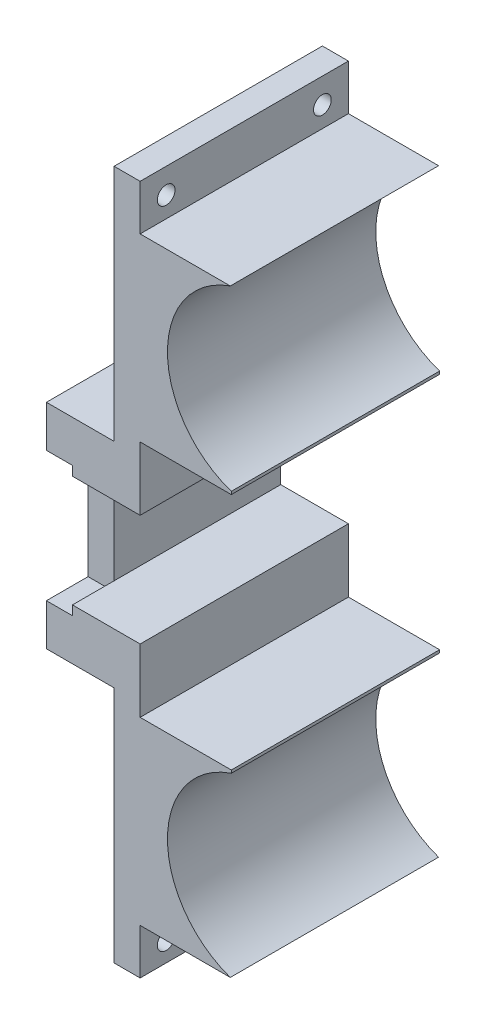
ISO-10303-21;
HEADER;
FILE_DESCRIPTION(('STEP AP214'),'2;1');
FILE_NAME('part.step','',(''),(''),'','','');
FILE_SCHEMA(('AUTOMOTIVE_DESIGN { 1 0 10303 214 1 1 1 1 }'));
ENDSEC;
DATA;
#1=APPLICATION_CONTEXT('core data for automotive mechanical design processes');
#2=APPLICATION_PROTOCOL_DEFINITION('international standard','automotive_design',2000,#1);
#3=PRODUCT_CONTEXT('',#1,'mechanical');
#4=PRODUCT('Part','Part','',(#3));
#5=PRODUCT_RELATED_PRODUCT_CATEGORY('part','',(#4));
#6=PRODUCT_DEFINITION_FORMATION('','',#4);
#7=PRODUCT_DEFINITION_CONTEXT('part definition',#1,'design');
#8=PRODUCT_DEFINITION('design','',#6,#7);
#9=PRODUCT_DEFINITION_SHAPE('','',#8);
#10=(LENGTH_UNIT() NAMED_UNIT(*) SI_UNIT(.MILLI.,.METRE.));
#11=(NAMED_UNIT(*) PLANE_ANGLE_UNIT() SI_UNIT($,.RADIAN.));
#12=(NAMED_UNIT(*) SI_UNIT($,.STERADIAN.) SOLID_ANGLE_UNIT());
#13=UNCERTAINTY_MEASURE_WITH_UNIT(LENGTH_MEASURE(1.E-05),#10,'distance_accuracy_value','');
#14=(GEOMETRIC_REPRESENTATION_CONTEXT(3) GLOBAL_UNCERTAINTY_ASSIGNED_CONTEXT((#13)) GLOBAL_UNIT_ASSIGNED_CONTEXT((#10,
#11,#12)) REPRESENTATION_CONTEXT('',''));
#15=CARTESIAN_POINT('',(0.,0.,0.));
#16=DIRECTION('',(0.,0.,1.));
#17=DIRECTION('',(1.,0.,0.));
#18=AXIS2_PLACEMENT_3D('',#15,#16,#17);
#19=CARTESIAN_POINT('',(0.,0.,40.));
#20=DIRECTION('',(1.,0.,0.));
#21=DIRECTION('',(0.,1.,0.));
#22=AXIS2_PLACEMENT_3D('',#19,#20,#21);
#23=PLANE('',#22);
#24=DIRECTION('',(0.,0.,1.));
#25=VECTOR('',#24,1.);
#26=CARTESIAN_POINT('',(0.,-12.5,32.));
#27=LINE('',#26,#25);
#28=CARTESIAN_POINT('',(0.,-12.5,32.));
#29=VERTEX_POINT('',#28);
#30=CARTESIAN_POINT('',(0.,-12.5,40.));
#31=VERTEX_POINT('',#30);
#32=EDGE_CURVE('E506',#29,#31,#27,.T.);
#33=ORIENTED_EDGE('',*,*,#32,.F.);
#34=DIRECTION('',(0.,1.,0.));
#35=VECTOR('',#34,1.);
#36=CARTESIAN_POINT('',(0.,12.5,32.));
#37=LINE('',#36,#35);
#38=CARTESIAN_POINT('',(0.,12.5,32.));
#39=VERTEX_POINT('',#38);
#40=EDGE_CURVE('E489',#29,#39,#37,.T.);
#41=ORIENTED_EDGE('',*,*,#40,.T.);
#42=DIRECTION('',(0.,0.,1.));
#43=VECTOR('',#42,1.);
#44=CARTESIAN_POINT('',(0.,12.5,32.));
#45=LINE('',#44,#43);
#46=CARTESIAN_POINT('',(0.,12.5,40.));
#47=VERTEX_POINT('',#46);
#48=EDGE_CURVE('E504',#39,#47,#45,.T.);
#49=ORIENTED_EDGE('',*,*,#48,.T.);
#50=DIRECTION('',(0.,-1.,0.));
#51=VECTOR('',#50,1.);
#52=CARTESIAN_POINT('',(0.,0.,40.));
#53=LINE('',#52,#51);
#54=CARTESIAN_POINT('',(0.,20.5,40.));
#55=VERTEX_POINT('',#54);
#56=EDGE_CURVE('E241',#55,#47,#53,.T.);
#57=ORIENTED_EDGE('',*,*,#56,.F.);
#58=DIRECTION('',(0.,0.,-1.));
#59=VECTOR('',#58,1.);
#60=CARTESIAN_POINT('',(0.,20.5,40.));
#61=LINE('',#60,#59);
#62=CARTESIAN_POINT('',(0.,20.5,0.));
#63=VERTEX_POINT('',#62);
#64=EDGE_CURVE('E269',#55,#63,#61,.T.);
#65=ORIENTED_EDGE('',*,*,#64,.T.);
#66=DIRECTION('',(0.,-1.,0.));
#67=VECTOR('',#66,1.);
#68=CARTESIAN_POINT('',(0.,0.,0.));
#69=LINE('',#68,#67);
#70=CARTESIAN_POINT('',(0.,-20.5,0.));
#71=VERTEX_POINT('',#70);
#72=EDGE_CURVE('E181',#63,#71,#69,.T.);
#73=ORIENTED_EDGE('',*,*,#72,.T.);
#74=DIRECTION('',(0.,0.,-1.));
#75=VECTOR('',#74,1.);
#76=CARTESIAN_POINT('',(0.,-20.5,40.));
#77=LINE('',#76,#75);
#78=CARTESIAN_POINT('',(0.,-20.5,40.));
#79=VERTEX_POINT('',#78);
#80=EDGE_CURVE('E199',#79,#71,#77,.T.);
#81=ORIENTED_EDGE('',*,*,#80,.F.);
#82=EDGE_CURVE('E240',#31,#79,#53,.T.);
#83=ORIENTED_EDGE('',*,*,#82,.F.);
#84=EDGE_LOOP('',(#33,#41,#49,#57,#65,#73,#81,#83));
#85=FACE_BOUND('',#84,.T.);
#86=CARTESIAN_POINT('',(0.,0.,20.));
#87=DIRECTION('',(-1.,0.,0.));
#88=DIRECTION('',(0.,0.,1.));
#89=AXIS2_PLACEMENT_3D('',#86,#87,#88);
#90=CIRCLE('',#89,1.69999999999999);
#91=CARTESIAN_POINT('',(0.,0.,21.7));
#92=VERTEX_POINT('',#91);
#93=EDGE_CURVE('E862',#92,#92,#90,.T.);
#94=ORIENTED_EDGE('',*,*,#93,.F.);
#95=EDGE_LOOP('',(#94));
#96=FACE_BOUND('',#95,.T.);
#97=ADVANCED_FACE('F43',(#85,#96),#23,.F.);
#98=CARTESIAN_POINT('',(0.,0.,40.));
#99=DIRECTION('',(0.,0.,1.));
#100=DIRECTION('',(1.,0.,0.));
#101=AXIS2_PLACEMENT_3D('',#98,#99,#100);
#102=PLANE('',#101);
#103=DIRECTION('',(-1.,0.,0.));
#104=VECTOR('',#103,1.);
#105=CARTESIAN_POINT('',(0.,-10.7,40.));
#106=LINE('',#105,#104);
#107=CARTESIAN_POINT('',(18.,-10.7,40.));
#108=VERTEX_POINT('',#107);
#109=CARTESIAN_POINT('',(5.00000000000001,-10.7,40.));
#110=VERTEX_POINT('',#109);
#111=EDGE_CURVE('E238',#108,#110,#106,.T.);
#112=ORIENTED_EDGE('',*,*,#111,.T.);
#113=DIRECTION('',(0.,-1.,0.));
#114=VECTOR('',#113,1.);
#115=CARTESIAN_POINT('',(5.00000000000001,12.5,40.));
#116=LINE('',#115,#114);
#117=CARTESIAN_POINT('',(5.00000000000001,-12.5,40.));
#118=VERTEX_POINT('',#117);
#119=EDGE_CURVE('E465',#110,#118,#116,.T.);
#120=ORIENTED_EDGE('',*,*,#119,.T.);
#121=DIRECTION('',(-1.,0.,0.));
#122=VECTOR('',#121,1.);
#123=CARTESIAN_POINT('',(5.00000000000001,-12.5,40.));
#124=LINE('',#123,#122);
#125=EDGE_CURVE('E499',#118,#31,#124,.T.);
#126=ORIENTED_EDGE('',*,*,#125,.T.);
#127=ORIENTED_EDGE('',*,*,#82,.T.);
#128=DIRECTION('',(1.,0.,0.));
#129=VECTOR('',#128,1.);
#130=CARTESIAN_POINT('',(0.,-20.5,40.));
#131=LINE('',#130,#129);
#132=CARTESIAN_POINT('',(13.,-20.5,40.));
#133=VERTEX_POINT('',#132);
#134=EDGE_CURVE('E244',#79,#133,#131,.T.);
#135=ORIENTED_EDGE('',*,*,#134,.T.);
#136=DIRECTION('',(0.,-1.,0.));
#137=VECTOR('',#136,1.);
#138=CARTESIAN_POINT('',(13.,0.,40.));
#139=LINE('',#138,#137);
#140=CARTESIAN_POINT('',(13.,-66.25,40.));
#141=VERTEX_POINT('',#140);
#142=EDGE_CURVE('E143',#133,#141,#139,.T.);
#143=ORIENTED_EDGE('',*,*,#142,.T.);
#144=DIRECTION('',(1.,0.,0.));
#145=VECTOR('',#144,1.);
#146=CARTESIAN_POINT('',(0.,-66.25,40.));
#147=LINE('',#146,#145);
#148=CARTESIAN_POINT('',(18.,-66.25,40.));
#149=VERTEX_POINT('',#148);
#150=EDGE_CURVE('E135',#141,#149,#147,.T.);
#151=ORIENTED_EDGE('',*,*,#150,.T.);
#152=DIRECTION('',(0.,1.,0.));
#153=VECTOR('',#152,1.);
#154=CARTESIAN_POINT('',(18.,0.,40.));
#155=LINE('',#154,#153);
#156=CARTESIAN_POINT('',(18.,-57.5,40.));
#157=VERTEX_POINT('',#156);
#158=EDGE_CURVE('E140',#149,#157,#155,.T.);
#159=ORIENTED_EDGE('',*,*,#158,.T.);
#160=DIRECTION('',(1.,0.,0.));
#161=VECTOR('',#160,1.);
#162=CARTESIAN_POINT('',(0.,-57.5,40.));
#163=LINE('',#162,#161);
#164=CARTESIAN_POINT('',(35.3143680347579,-57.5,40.));
#165=VERTEX_POINT('',#164);
#166=EDGE_CURVE('E67',#157,#165,#163,.T.);
#167=ORIENTED_EDGE('',*,*,#166,.T.);
#168=CARTESIAN_POINT('',(41.25,-40.506816861659,40.));
#169=DIRECTION('',(0.,0.,1.));
#170=DIRECTION('',(1.,0.,0.));
#171=AXIS2_PLACEMENT_3D('',#168,#169,#170);
#172=CIRCLE('',#171,18.);
#173=CARTESIAN_POINT('',(35.508342613226,-23.4471166751697,40.));
#174=VERTEX_POINT('',#173);
#175=EDGE_CURVE('E192',#174,#165,#172,.T.);
#176=ORIENTED_EDGE('',*,*,#175,.F.);
#177=DIRECTION('',(0.,-1.,0.));
#178=VECTOR('',#177,1.);
#179=CARTESIAN_POINT('',(35.5083426132258,4.50340180219058E-13,40.));
#180=LINE('',#179,#178);
#181=CARTESIAN_POINT('',(35.508342613226,-22.9,40.));
#182=VERTEX_POINT('',#181);
#183=EDGE_CURVE('E226',#182,#174,#180,.T.);
#184=ORIENTED_EDGE('',*,*,#183,.F.);
#185=DIRECTION('',(-1.,0.,0.));
#186=VECTOR('',#185,1.);
#187=CARTESIAN_POINT('',(0.,-22.9,40.));
#188=LINE('',#187,#186);
#189=CARTESIAN_POINT('',(18.,-22.9,40.));
#190=VERTEX_POINT('',#189);
#191=EDGE_CURVE('E216',#182,#190,#188,.T.);
#192=ORIENTED_EDGE('',*,*,#191,.T.);
#193=DIRECTION('',(0.,1.,0.));
#194=VECTOR('',#193,1.);
#195=CARTESIAN_POINT('',(18.,0.,40.));
#196=LINE('',#195,#194);
#197=EDGE_CURVE('E236',#190,#108,#196,.T.);
#198=ORIENTED_EDGE('',*,*,#197,.T.);
#199=EDGE_LOOP('',(#112,#120,#126,#127,#135,#143,#151,#159,#167,#176,#184,#192,#198));
#200=FACE_BOUND('',#199,.T.);
#201=ADVANCED_FACE('F138',(#200),#102,.T.);
#202=DIRECTION('',(1.,0.,0.));
#203=VECTOR('',#202,1.);
#204=CARTESIAN_POINT('',(5.00000000000001,12.5,40.));
#205=LINE('',#204,#203);
#206=CARTESIAN_POINT('',(5.00000000000001,12.5,40.));
#207=VERTEX_POINT('',#206);
#208=EDGE_CURVE('E482',#47,#207,#205,.T.);
#209=ORIENTED_EDGE('',*,*,#208,.T.);
#210=CARTESIAN_POINT('',(5.00000000000001,10.7,40.));
#211=VERTEX_POINT('',#210);
#212=EDGE_CURVE('E496',#207,#211,#116,.T.);
#213=ORIENTED_EDGE('',*,*,#212,.T.);
#214=DIRECTION('',(-1.,0.,0.));
#215=VECTOR('',#214,1.);
#216=CARTESIAN_POINT('',(0.,10.7,40.));
#217=LINE('',#216,#215);
#218=CARTESIAN_POINT('',(18.,10.7,40.));
#219=VERTEX_POINT('',#218);
#220=EDGE_CURVE('E431',#219,#211,#217,.T.);
#221=ORIENTED_EDGE('',*,*,#220,.F.);
#222=DIRECTION('',(0.,-1.,0.));
#223=VECTOR('',#222,1.);
#224=CARTESIAN_POINT('',(18.,0.,40.));
#225=LINE('',#224,#223);
#226=CARTESIAN_POINT('',(18.,22.9,40.));
#227=VERTEX_POINT('',#226);
#228=EDGE_CURVE('E434',#227,#219,#225,.T.);
#229=ORIENTED_EDGE('',*,*,#228,.F.);
#230=DIRECTION('',(-1.,0.,0.));
#231=VECTOR('',#230,1.);
#232=CARTESIAN_POINT('',(0.,22.9,40.));
#233=LINE('',#232,#231);
#234=CARTESIAN_POINT('',(35.508342613226,22.9,40.));
#235=VERTEX_POINT('',#234);
#236=EDGE_CURVE('E416',#235,#227,#233,.T.);
#237=ORIENTED_EDGE('',*,*,#236,.F.);
#238=DIRECTION('',(0.,1.,0.));
#239=VECTOR('',#238,1.);
#240=CARTESIAN_POINT('',(35.5083426132258,-4.50340180219058E-13,40.));
#241=LINE('',#240,#239);
#242=CARTESIAN_POINT('',(35.508342613226,23.4471166751697,40.));
#243=VERTEX_POINT('',#242);
#244=EDGE_CURVE('E307',#235,#243,#241,.T.);
#245=ORIENTED_EDGE('',*,*,#244,.T.);
#246=CARTESIAN_POINT('',(41.25,40.506816861659,40.));
#247=DIRECTION('',(0.,0.,-1.));
#248=DIRECTION('',(1.,0.,0.));
#249=AXIS2_PLACEMENT_3D('',#246,#247,#248);
#250=CIRCLE('',#249,18.);
#251=CARTESIAN_POINT('',(35.3143680347579,57.5,40.));
#252=VERTEX_POINT('',#251);
#253=EDGE_CURVE('E302',#243,#252,#250,.T.);
#254=ORIENTED_EDGE('',*,*,#253,.T.);
#255=DIRECTION('',(1.,0.,0.));
#256=VECTOR('',#255,1.);
#257=CARTESIAN_POINT('',(0.,57.5,40.));
#258=LINE('',#257,#256);
#259=CARTESIAN_POINT('',(18.,57.5,40.));
#260=VERTEX_POINT('',#259);
#261=EDGE_CURVE('E345',#260,#252,#258,.T.);
#262=ORIENTED_EDGE('',*,*,#261,.F.);
#263=DIRECTION('',(0.,-1.,0.));
#264=VECTOR('',#263,1.);
#265=CARTESIAN_POINT('',(18.,0.,40.));
#266=LINE('',#265,#264);
#267=CARTESIAN_POINT('',(18.,66.25,40.));
#268=VERTEX_POINT('',#267);
#269=EDGE_CURVE('E419',#268,#260,#266,.T.);
#270=ORIENTED_EDGE('',*,*,#269,.F.);
#271=DIRECTION('',(1.,0.,0.));
#272=VECTOR('',#271,1.);
#273=CARTESIAN_POINT('',(0.,66.25,40.));
#274=LINE('',#273,#272);
#275=CARTESIAN_POINT('',(13.,66.25,40.));
#276=VERTEX_POINT('',#275);
#277=EDGE_CURVE('E425',#276,#268,#274,.T.);
#278=ORIENTED_EDGE('',*,*,#277,.F.);
#279=DIRECTION('',(0.,1.,0.));
#280=VECTOR('',#279,1.);
#281=CARTESIAN_POINT('',(13.,0.,40.));
#282=LINE('',#281,#280);
#283=CARTESIAN_POINT('',(13.,20.5,40.));
#284=VERTEX_POINT('',#283);
#285=EDGE_CURVE('E427',#284,#276,#282,.T.);
#286=ORIENTED_EDGE('',*,*,#285,.F.);
#287=DIRECTION('',(1.,0.,0.));
#288=VECTOR('',#287,1.);
#289=CARTESIAN_POINT('',(0.,20.5,40.));
#290=LINE('',#289,#288);
#291=EDGE_CURVE('E429',#55,#284,#290,.T.);
#292=ORIENTED_EDGE('',*,*,#291,.F.);
#293=ORIENTED_EDGE('',*,*,#56,.T.);
#294=EDGE_LOOP('',(#209,#213,#221,#229,#237,#245,#254,#262,#270,#278,#286,#292,#293));
#295=FACE_BOUND('',#294,.T.);
#296=ADVANCED_FACE('F413',(#295),#102,.T.);
#297=CARTESIAN_POINT('',(41.25,-40.506816861659,40.));
#298=DIRECTION('',(0.,0.,-1.));
#299=DIRECTION('',(-1.,0.,0.));
#300=AXIS2_PLACEMENT_3D('',#297,#298,#299);
#301=CYLINDRICAL_SURFACE('',#300,18.);
#302=CARTESIAN_POINT('',(41.25,-40.506816861659,0.));
#303=DIRECTION('',(0.,0.,1.));
#304=DIRECTION('',(1.,0.,0.));
#305=AXIS2_PLACEMENT_3D('',#302,#303,#304);
#306=CIRCLE('',#305,18.);
#307=CARTESIAN_POINT('',(35.508342613226,-23.4471166751697,0.));
#308=VERTEX_POINT('',#307);
#309=CARTESIAN_POINT('',(35.3143680347579,-57.5,0.));
#310=VERTEX_POINT('',#309);
#311=EDGE_CURVE('E164',#308,#310,#306,.T.);
#312=ORIENTED_EDGE('',*,*,#311,.F.);
#313=DIRECTION('',(0.,0.,-1.));
#314=VECTOR('',#313,1.);
#315=CARTESIAN_POINT('',(35.508342613226,-23.4471166751697,40.));
#316=LINE('',#315,#314);
#317=EDGE_CURVE('E11',#174,#308,#316,.T.);
#318=ORIENTED_EDGE('',*,*,#317,.F.);
#319=ORIENTED_EDGE('',*,*,#175,.T.);
#320=DIRECTION('',(0.,0.,-1.));
#321=VECTOR('',#320,1.);
#322=CARTESIAN_POINT('',(35.3143680347579,-57.5,40.));
#323=LINE('',#322,#321);
#324=EDGE_CURVE('E108',#165,#310,#323,.T.);
#325=ORIENTED_EDGE('',*,*,#324,.T.);
#326=EDGE_LOOP('',(#312,#318,#319,#325));
#327=FACE_BOUND('',#326,.T.);
#328=ADVANCED_FACE('F45',(#327),#301,.F.);
#329=CARTESIAN_POINT('',(35.5083426132258,4.50340180219058E-13,40.));
#330=DIRECTION('',(1.,0.,0.));
#331=DIRECTION('',(0.,1.,0.));
#332=AXIS2_PLACEMENT_3D('',#329,#330,#331);
#333=PLANE('',#332);
#334=DIRECTION('',(0.,-1.,0.));
#335=VECTOR('',#334,1.);
#336=CARTESIAN_POINT('',(35.5083426132258,4.50340180219058E-13,0.));
#337=LINE('',#336,#335);
#338=CARTESIAN_POINT('',(35.508342613226,-22.9,0.));
#339=VERTEX_POINT('',#338);
#340=EDGE_CURVE('E167',#339,#308,#337,.T.);
#341=ORIENTED_EDGE('',*,*,#340,.F.);
#342=DIRECTION('',(0.,0.,-1.));
#343=VECTOR('',#342,1.);
#344=CARTESIAN_POINT('',(35.508342613226,-22.9,40.));
#345=LINE('',#344,#343);
#346=EDGE_CURVE('E51',#182,#339,#345,.T.);
#347=ORIENTED_EDGE('',*,*,#346,.F.);
#348=ORIENTED_EDGE('',*,*,#183,.T.);
#349=ORIENTED_EDGE('',*,*,#317,.T.);
#350=EDGE_LOOP('',(#341,#347,#348,#349));
#351=FACE_BOUND('',#350,.T.);
#352=ADVANCED_FACE('F225',(#351),#333,.T.);
#353=CARTESIAN_POINT('',(0.,-22.9,40.));
#354=DIRECTION('',(0.,-1.,0.));
#355=DIRECTION('',(1.,0.,0.));
#356=AXIS2_PLACEMENT_3D('',#353,#354,#355);
#357=PLANE('',#356);
#358=DIRECTION('',(-1.,0.,0.));
#359=VECTOR('',#358,1.);
#360=CARTESIAN_POINT('',(0.,-22.9,0.));
#361=LINE('',#360,#359);
#362=CARTESIAN_POINT('',(18.,-22.9,0.));
#363=VERTEX_POINT('',#362);
#364=EDGE_CURVE('E171',#339,#363,#361,.T.);
#365=ORIENTED_EDGE('',*,*,#364,.T.);
#366=DIRECTION('',(0.,0.,-1.));
#367=VECTOR('',#366,1.);
#368=CARTESIAN_POINT('',(18.,-22.9,40.));
#369=LINE('',#368,#367);
#370=EDGE_CURVE('E209',#190,#363,#369,.T.);
#371=ORIENTED_EDGE('',*,*,#370,.F.);
#372=ORIENTED_EDGE('',*,*,#191,.F.);
#373=ORIENTED_EDGE('',*,*,#346,.T.);
#374=EDGE_LOOP('',(#365,#371,#372,#373));
#375=FACE_BOUND('',#374,.T.);
#376=ADVANCED_FACE('F214',(#375),#357,.F.);
#377=CARTESIAN_POINT('',(18.,0.,40.));
#378=DIRECTION('',(-1.,0.,0.));
#379=DIRECTION('',(0.,0.,1.));
#380=AXIS2_PLACEMENT_3D('',#377,#378,#379);
#381=PLANE('',#380);
#382=DIRECTION('',(0.,1.,0.));
#383=VECTOR('',#382,1.);
#384=CARTESIAN_POINT('',(18.,0.,0.));
#385=LINE('',#384,#383);
#386=CARTESIAN_POINT('',(18.,-10.7,0.));
#387=VERTEX_POINT('',#386);
#388=EDGE_CURVE('E173',#363,#387,#385,.T.);
#389=ORIENTED_EDGE('',*,*,#388,.T.);
#390=DIRECTION('',(0.,0.,-1.));
#391=VECTOR('',#390,1.);
#392=CARTESIAN_POINT('',(18.,-10.7,40.));
#393=LINE('',#392,#391);
#394=EDGE_CURVE('E206',#108,#387,#393,.T.);
#395=ORIENTED_EDGE('',*,*,#394,.F.);
#396=ORIENTED_EDGE('',*,*,#197,.F.);
#397=ORIENTED_EDGE('',*,*,#370,.T.);
#398=EDGE_LOOP('',(#389,#395,#396,#397));
#399=FACE_BOUND('',#398,.T.);
#400=ADVANCED_FACE('F460',(#399),#381,.F.);
#401=CARTESIAN_POINT('',(0.,-10.7,40.));
#402=DIRECTION('',(0.,-1.,0.));
#403=DIRECTION('',(1.,0.,0.));
#404=AXIS2_PLACEMENT_3D('',#401,#402,#403);
#405=PLANE('',#404);
#406=DIRECTION('',(-1.,0.,0.));
#407=VECTOR('',#406,1.);
#408=CARTESIAN_POINT('',(0.,-10.7,0.));
#409=LINE('',#408,#407);
#410=CARTESIAN_POINT('',(5.,-10.7,0.));
#411=VERTEX_POINT('',#410);
#412=EDGE_CURVE('E175',#387,#411,#409,.T.);
#413=ORIENTED_EDGE('',*,*,#412,.T.);
#414=DIRECTION('',(0.,0.,-1.));
#415=VECTOR('',#414,1.);
#416=CARTESIAN_POINT('',(5.,-10.7,40.));
#417=LINE('',#416,#415);
#418=CARTESIAN_POINT('',(5.00000000000001,-10.7,32.));
#419=VERTEX_POINT('',#418);
#420=EDGE_CURVE('E202',#419,#411,#417,.T.);
#421=ORIENTED_EDGE('',*,*,#420,.F.);
#422=EDGE_CURVE('E203',#110,#419,#417,.T.);
#423=ORIENTED_EDGE('',*,*,#422,.F.);
#424=ORIENTED_EDGE('',*,*,#111,.F.);
#425=ORIENTED_EDGE('',*,*,#394,.T.);
#426=EDGE_LOOP('',(#413,#421,#423,#424,#425));
#427=FACE_BOUND('',#426,.T.);
#428=ADVANCED_FACE('F454',(#427),#405,.F.);
#429=CARTESIAN_POINT('',(5.,0.,40.));
#430=DIRECTION('',(-1.,0.,0.));
#431=DIRECTION('',(0.,0.,1.));
#432=AXIS2_PLACEMENT_3D('',#429,#430,#431);
#433=PLANE('',#432);
#434=CARTESIAN_POINT('',(5.,0.,20.));
#435=DIRECTION('',(-1.,0.,0.));
#436=DIRECTION('',(0.,0.,1.));
#437=AXIS2_PLACEMENT_3D('',#434,#435,#436);
#438=CIRCLE('',#437,1.69999999999999);
#439=CARTESIAN_POINT('',(5.,0.,21.7));
#440=VERTEX_POINT('',#439);
#441=EDGE_CURVE('E486',#440,#440,#438,.T.);
#442=ORIENTED_EDGE('',*,*,#441,.T.);
#443=EDGE_LOOP('',(#442));
#444=FACE_BOUND('',#443,.T.);
#445=DIRECTION('',(0.,0.,-1.));
#446=VECTOR('',#445,1.);
#447=CARTESIAN_POINT('',(5.,10.7,40.));
#448=LINE('',#447,#446);
#449=CARTESIAN_POINT('',(5.,10.7,32.));
#450=VERTEX_POINT('',#449);
#451=CARTESIAN_POINT('',(5.,10.7,0.));
#452=VERTEX_POINT('',#451);
#453=EDGE_CURVE('E316',#450,#452,#448,.T.);
#454=ORIENTED_EDGE('',*,*,#453,.F.);
#455=DIRECTION('',(0.,-1.,0.));
#456=VECTOR('',#455,1.);
#457=CARTESIAN_POINT('',(5.00000000000001,12.5,32.));
#458=LINE('',#457,#456);
#459=EDGE_CURVE('E477',#450,#419,#458,.T.);
#460=ORIENTED_EDGE('',*,*,#459,.T.);
#461=ORIENTED_EDGE('',*,*,#420,.T.);
#462=DIRECTION('',(0.,1.,0.));
#463=VECTOR('',#462,1.);
#464=CARTESIAN_POINT('',(5.,0.,0.));
#465=LINE('',#464,#463);
#466=EDGE_CURVE('E178',#411,#452,#465,.T.);
#467=ORIENTED_EDGE('',*,*,#466,.T.);
#468=EDGE_LOOP('',(#454,#460,#461,#467));
#469=FACE_BOUND('',#468,.T.);
#470=ADVANCED_FACE('F451',(#444,#469),#433,.F.);
#471=CARTESIAN_POINT('',(0.,-20.5,40.));
#472=DIRECTION('',(0.,1.,0.));
#473=DIRECTION('',(0.,0.,1.));
#474=AXIS2_PLACEMENT_3D('',#471,#472,#473);
#475=PLANE('',#474);
#476=DIRECTION('',(1.,0.,0.));
#477=VECTOR('',#476,1.);
#478=CARTESIAN_POINT('',(0.,-20.5,0.));
#479=LINE('',#478,#477);
#480=CARTESIAN_POINT('',(13.,-20.5,0.));
#481=VERTEX_POINT('',#480);
#482=EDGE_CURVE('E183',#71,#481,#479,.T.);
#483=ORIENTED_EDGE('',*,*,#482,.T.);
#484=DIRECTION('',(0.,0.,-1.));
#485=VECTOR('',#484,1.);
#486=CARTESIAN_POINT('',(13.,-20.5,40.));
#487=LINE('',#486,#485);
#488=EDGE_CURVE('E196',#133,#481,#487,.T.);
#489=ORIENTED_EDGE('',*,*,#488,.F.);
#490=ORIENTED_EDGE('',*,*,#134,.F.);
#491=ORIENTED_EDGE('',*,*,#80,.T.);
#492=EDGE_LOOP('',(#483,#489,#490,#491));
#493=FACE_BOUND('',#492,.T.);
#494=ADVANCED_FACE('F251',(#493),#475,.F.);
#495=CARTESIAN_POINT('',(13.,0.,40.));
#496=DIRECTION('',(1.,0.,0.));
#497=DIRECTION('',(0.,1.,0.));
#498=AXIS2_PLACEMENT_3D('',#495,#496,#497);
#499=PLANE('',#498);
#500=CARTESIAN_POINT('',(13.,-62.481816861659,35.));
#501=DIRECTION('',(-1.,0.,0.));
#502=DIRECTION('',(0.,0.,1.));
#503=AXIS2_PLACEMENT_3D('',#500,#501,#502);
#504=CIRCLE('',#503,1.69999999999999);
#505=CARTESIAN_POINT('',(13.,-62.481816861659,36.7));
#506=VERTEX_POINT('',#505);
#507=EDGE_CURVE('E511',#506,#506,#504,.T.);
#508=ORIENTED_EDGE('',*,*,#507,.F.);
#509=EDGE_LOOP('',(#508));
#510=FACE_BOUND('',#509,.T.);
#511=CARTESIAN_POINT('',(13.,-62.481816861659,5.00000000000004));
#512=DIRECTION('',(-1.,0.,0.));
#513=DIRECTION('',(0.,0.,1.));
#514=AXIS2_PLACEMENT_3D('',#511,#512,#513);
#515=CIRCLE('',#514,1.69999999999999);
#516=CARTESIAN_POINT('',(13.,-62.481816861659,6.70000000000002));
#517=VERTEX_POINT('',#516);
#518=EDGE_CURVE('E517',#517,#517,#515,.T.);
#519=ORIENTED_EDGE('',*,*,#518,.F.);
#520=EDGE_LOOP('',(#519));
#521=FACE_BOUND('',#520,.T.);
#522=DIRECTION('',(0.,-1.,0.));
#523=VECTOR('',#522,1.);
#524=CARTESIAN_POINT('',(13.,0.,0.));
#525=LINE('',#524,#523);
#526=CARTESIAN_POINT('',(13.,-66.25,0.));
#527=VERTEX_POINT('',#526);
#528=EDGE_CURVE('E185',#481,#527,#525,.T.);
#529=ORIENTED_EDGE('',*,*,#528,.T.);
#530=DIRECTION('',(0.,0.,-1.));
#531=VECTOR('',#530,1.);
#532=CARTESIAN_POINT('',(13.,-66.25,40.));
#533=LINE('',#532,#531);
#534=EDGE_CURVE('E155',#141,#527,#533,.T.);
#535=ORIENTED_EDGE('',*,*,#534,.F.);
#536=ORIENTED_EDGE('',*,*,#142,.F.);
#537=ORIENTED_EDGE('',*,*,#488,.T.);
#538=EDGE_LOOP('',(#529,#535,#536,#537));
#539=FACE_BOUND('',#538,.T.);
#540=ADVANCED_FACE('F255',(#510,#521,#539),#499,.F.);
#541=CARTESIAN_POINT('',(0.,-66.25,40.));
#542=DIRECTION('',(0.,1.,0.));
#543=DIRECTION('',(0.,0.,1.));
#544=AXIS2_PLACEMENT_3D('',#541,#542,#543);
#545=PLANE('',#544);
#546=DIRECTION('',(1.,0.,0.));
#547=VECTOR('',#546,1.);
#548=CARTESIAN_POINT('',(0.,-66.25,0.));
#549=LINE('',#548,#547);
#550=CARTESIAN_POINT('',(18.,-66.25,0.));
#551=VERTEX_POINT('',#550);
#552=EDGE_CURVE('E152',#527,#551,#549,.T.);
#553=ORIENTED_EDGE('',*,*,#552,.T.);
#554=DIRECTION('',(0.,0.,-1.));
#555=VECTOR('',#554,1.);
#556=CARTESIAN_POINT('',(18.,-66.25,40.));
#557=LINE('',#556,#555);
#558=EDGE_CURVE('E149',#149,#551,#557,.T.);
#559=ORIENTED_EDGE('',*,*,#558,.F.);
#560=ORIENTED_EDGE('',*,*,#150,.F.);
#561=ORIENTED_EDGE('',*,*,#534,.T.);
#562=EDGE_LOOP('',(#553,#559,#560,#561));
#563=FACE_BOUND('',#562,.T.);
#564=ADVANCED_FACE('F150',(#563),#545,.F.);
#565=CARTESIAN_POINT('',(18.,0.,40.));
#566=DIRECTION('',(-1.,0.,0.));
#567=DIRECTION('',(0.,0.,1.));
#568=AXIS2_PLACEMENT_3D('',#565,#566,#567);
#569=PLANE('',#568);
#570=CARTESIAN_POINT('',(18.,-62.481816861659,35.));
#571=DIRECTION('',(-1.,0.,0.));
#572=DIRECTION('',(0.,0.,1.));
#573=AXIS2_PLACEMENT_3D('',#570,#571,#572);
#574=CIRCLE('',#573,1.69999999999999);
#575=CARTESIAN_POINT('',(18.,-62.481816861659,36.7));
#576=VERTEX_POINT('',#575);
#577=EDGE_CURVE('E514',#576,#576,#574,.T.);
#578=ORIENTED_EDGE('',*,*,#577,.T.);
#579=EDGE_LOOP('',(#578));
#580=FACE_BOUND('',#579,.T.);
#581=CARTESIAN_POINT('',(18.,-62.481816861659,5.00000000000004));
#582=DIRECTION('',(-1.,0.,0.));
#583=DIRECTION('',(0.,0.,1.));
#584=AXIS2_PLACEMENT_3D('',#581,#582,#583);
#585=CIRCLE('',#584,1.69999999999999);
#586=CARTESIAN_POINT('',(18.,-62.481816861659,6.70000000000003));
#587=VERTEX_POINT('',#586);
#588=EDGE_CURVE('E520',#587,#587,#585,.T.);
#589=ORIENTED_EDGE('',*,*,#588,.T.);
#590=EDGE_LOOP('',(#589));
#591=FACE_BOUND('',#590,.T.);
#592=DIRECTION('',(0.,1.,0.));
#593=VECTOR('',#592,1.);
#594=CARTESIAN_POINT('',(18.,0.,0.));
#595=LINE('',#594,#593);
#596=CARTESIAN_POINT('',(18.,-57.5,0.));
#597=VERTEX_POINT('',#596);
#598=EDGE_CURVE('E188',#551,#597,#595,.T.);
#599=ORIENTED_EDGE('',*,*,#598,.T.);
#600=DIRECTION('',(0.,0.,-1.));
#601=VECTOR('',#600,1.);
#602=CARTESIAN_POINT('',(18.,-57.5,40.));
#603=LINE('',#602,#601);
#604=EDGE_CURVE('E156',#157,#597,#603,.T.);
#605=ORIENTED_EDGE('',*,*,#604,.F.);
#606=ORIENTED_EDGE('',*,*,#158,.F.);
#607=ORIENTED_EDGE('',*,*,#558,.T.);
#608=EDGE_LOOP('',(#599,#605,#606,#607));
#609=FACE_BOUND('',#608,.T.);
#610=ADVANCED_FACE('F158',(#580,#591,#609),#569,.F.);
#611=CARTESIAN_POINT('',(0.,-57.5,40.));
#612=DIRECTION('',(0.,1.,0.));
#613=DIRECTION('',(-1.,0.,0.));
#614=AXIS2_PLACEMENT_3D('',#611,#612,#613);
#615=PLANE('',#614);
#616=DIRECTION('',(1.,0.,0.));
#617=VECTOR('',#616,1.);
#618=CARTESIAN_POINT('',(0.,-57.5,0.));
#619=LINE('',#618,#617);
#620=EDGE_CURVE('E190',#597,#310,#619,.T.);
#621=ORIENTED_EDGE('',*,*,#620,.T.);
#622=ORIENTED_EDGE('',*,*,#324,.F.);
#623=ORIENTED_EDGE('',*,*,#166,.F.);
#624=ORIENTED_EDGE('',*,*,#604,.T.);
#625=EDGE_LOOP('',(#621,#622,#623,#624));
#626=FACE_BOUND('',#625,.T.);
#627=ADVANCED_FACE('F229',(#626),#615,.F.);
#628=CARTESIAN_POINT('',(0.,0.,0.));
#629=DIRECTION('',(0.,0.,1.));
#630=DIRECTION('',(1.,0.,0.));
#631=AXIS2_PLACEMENT_3D('',#628,#629,#630);
#632=PLANE('',#631);
#633=ORIENTED_EDGE('',*,*,#311,.T.);
#634=ORIENTED_EDGE('',*,*,#620,.F.);
#635=ORIENTED_EDGE('',*,*,#598,.F.);
#636=ORIENTED_EDGE('',*,*,#552,.F.);
#637=ORIENTED_EDGE('',*,*,#528,.F.);
#638=ORIENTED_EDGE('',*,*,#482,.F.);
#639=ORIENTED_EDGE('',*,*,#72,.F.);
#640=DIRECTION('',(1.,0.,0.));
#641=VECTOR('',#640,1.);
#642=CARTESIAN_POINT('',(0.,20.5,0.));
#643=LINE('',#642,#641);
#644=CARTESIAN_POINT('',(13.,20.5,0.));
#645=VERTEX_POINT('',#644);
#646=EDGE_CURVE('E263',#63,#645,#643,.T.);
#647=ORIENTED_EDGE('',*,*,#646,.T.);
#648=DIRECTION('',(0.,1.,0.));
#649=VECTOR('',#648,1.);
#650=CARTESIAN_POINT('',(13.,0.,0.));
#651=LINE('',#650,#649);
#652=CARTESIAN_POINT('',(13.,66.25,0.));
#653=VERTEX_POINT('',#652);
#654=EDGE_CURVE('E285',#645,#653,#651,.T.);
#655=ORIENTED_EDGE('',*,*,#654,.T.);
#656=DIRECTION('',(1.,0.,0.));
#657=VECTOR('',#656,1.);
#658=CARTESIAN_POINT('',(0.,66.25,0.));
#659=LINE('',#658,#657);
#660=CARTESIAN_POINT('',(18.,66.25,0.));
#661=VERTEX_POINT('',#660);
#662=EDGE_CURVE('E290',#653,#661,#659,.T.);
#663=ORIENTED_EDGE('',*,*,#662,.T.);
#664=DIRECTION('',(0.,-1.,0.));
#665=VECTOR('',#664,1.);
#666=CARTESIAN_POINT('',(18.,0.,0.));
#667=LINE('',#666,#665);
#668=CARTESIAN_POINT('',(18.,57.5,0.));
#669=VERTEX_POINT('',#668);
#670=EDGE_CURVE('E358',#661,#669,#667,.T.);
#671=ORIENTED_EDGE('',*,*,#670,.T.);
#672=DIRECTION('',(1.,0.,0.));
#673=VECTOR('',#672,1.);
#674=CARTESIAN_POINT('',(0.,57.5,0.));
#675=LINE('',#674,#673);
#676=CARTESIAN_POINT('',(35.3143680347579,57.5,0.));
#677=VERTEX_POINT('',#676);
#678=EDGE_CURVE('E341',#669,#677,#675,.T.);
#679=ORIENTED_EDGE('',*,*,#678,.T.);
#680=CARTESIAN_POINT('',(41.25,40.506816861659,0.));
#681=DIRECTION('',(0.,0.,-1.));
#682=DIRECTION('',(1.,0.,0.));
#683=AXIS2_PLACEMENT_3D('',#680,#681,#682);
#684=CIRCLE('',#683,18.);
#685=CARTESIAN_POINT('',(35.508342613226,23.4471166751697,0.));
#686=VERTEX_POINT('',#685);
#687=EDGE_CURVE('E351',#686,#677,#684,.T.);
#688=ORIENTED_EDGE('',*,*,#687,.F.);
#689=DIRECTION('',(0.,1.,0.));
#690=VECTOR('',#689,1.);
#691=CARTESIAN_POINT('',(35.5083426132258,-4.50340180219058E-13,0.));
#692=LINE('',#691,#690);
#693=CARTESIAN_POINT('',(35.508342613226,22.9,0.));
#694=VERTEX_POINT('',#693);
#695=EDGE_CURVE('E299',#694,#686,#692,.T.);
#696=ORIENTED_EDGE('',*,*,#695,.F.);
#697=DIRECTION('',(-1.,0.,0.));
#698=VECTOR('',#697,1.);
#699=CARTESIAN_POINT('',(0.,22.9,0.));
#700=LINE('',#699,#698);
#701=CARTESIAN_POINT('',(18.,22.9,0.));
#702=VERTEX_POINT('',#701);
#703=EDGE_CURVE('E296',#694,#702,#700,.T.);
#704=ORIENTED_EDGE('',*,*,#703,.T.);
#705=DIRECTION('',(0.,-1.,0.));
#706=VECTOR('',#705,1.);
#707=CARTESIAN_POINT('',(18.,0.,0.));
#708=LINE('',#707,#706);
#709=CARTESIAN_POINT('',(18.,10.7,0.));
#710=VERTEX_POINT('',#709);
#711=EDGE_CURVE('E288',#702,#710,#708,.T.);
#712=ORIENTED_EDGE('',*,*,#711,.T.);
#713=DIRECTION('',(-1.,0.,0.));
#714=VECTOR('',#713,1.);
#715=CARTESIAN_POINT('',(0.,10.7,0.));
#716=LINE('',#715,#714);
#717=EDGE_CURVE('E284',#710,#452,#716,.T.);
#718=ORIENTED_EDGE('',*,*,#717,.T.);
#719=ORIENTED_EDGE('',*,*,#466,.F.);
#720=ORIENTED_EDGE('',*,*,#412,.F.);
#721=ORIENTED_EDGE('',*,*,#388,.F.);
#722=ORIENTED_EDGE('',*,*,#364,.F.);
#723=ORIENTED_EDGE('',*,*,#340,.T.);
#724=EDGE_LOOP('',(#633,#634,#635,#636,#637,#638,#639,#647,#655,#663,#671,#679,#688,#696,#704,
#712,#718,#719,#720,#721,#722,#723));
#725=FACE_BOUND('',#724,.T.);
#726=ADVANCED_FACE('F223',(#725),#632,.F.);
#727=CARTESIAN_POINT('',(41.25,40.506816861659,40.));
#728=DIRECTION('',(0.,0.,-1.));
#729=DIRECTION('',(-1.,0.,0.));
#730=AXIS2_PLACEMENT_3D('',#727,#728,#729);
#731=CYLINDRICAL_SURFACE('',#730,18.);
#732=ORIENTED_EDGE('',*,*,#687,.T.);
#733=DIRECTION('',(0.,0.,-1.));
#734=VECTOR('',#733,1.);
#735=CARTESIAN_POINT('',(35.3143680347579,57.5,40.));
#736=LINE('',#735,#734);
#737=EDGE_CURVE('E168',#252,#677,#736,.T.);
#738=ORIENTED_EDGE('',*,*,#737,.F.);
#739=ORIENTED_EDGE('',*,*,#253,.F.);
#740=DIRECTION('',(0.,0.,-1.));
#741=VECTOR('',#740,1.);
#742=CARTESIAN_POINT('',(35.508342613226,23.4471166751697,40.));
#743=LINE('',#742,#741);
#744=EDGE_CURVE('E303',#243,#686,#743,.T.);
#745=ORIENTED_EDGE('',*,*,#744,.T.);
#746=EDGE_LOOP('',(#732,#738,#739,#745));
#747=FACE_BOUND('',#746,.T.);
#748=ADVANCED_FACE('F352',(#747),#731,.F.);
#749=CARTESIAN_POINT('',(0.,57.5,40.));
#750=DIRECTION('',(0.,1.,0.));
#751=DIRECTION('',(-1.,0.,0.));
#752=AXIS2_PLACEMENT_3D('',#749,#750,#751);
#753=PLANE('',#752);
#754=ORIENTED_EDGE('',*,*,#678,.F.);
#755=DIRECTION('',(0.,0.,-1.));
#756=VECTOR('',#755,1.);
#757=CARTESIAN_POINT('',(18.,57.5,40.));
#758=LINE('',#757,#756);
#759=EDGE_CURVE('E325',#260,#669,#758,.T.);
#760=ORIENTED_EDGE('',*,*,#759,.F.);
#761=ORIENTED_EDGE('',*,*,#261,.T.);
#762=ORIENTED_EDGE('',*,*,#737,.T.);
#763=EDGE_LOOP('',(#754,#760,#761,#762));
#764=FACE_BOUND('',#763,.T.);
#765=ADVANCED_FACE('F339',(#764),#753,.T.);
#766=CARTESIAN_POINT('',(18.,0.,40.));
#767=DIRECTION('',(1.,0.,0.));
#768=DIRECTION('',(0.,0.,-1.));
#769=AXIS2_PLACEMENT_3D('',#766,#767,#768);
#770=PLANE('',#769);
#771=CARTESIAN_POINT('',(18.,61.468183138341,35.));
#772=DIRECTION('',(1.,0.,0.));
#773=DIRECTION('',(0.,0.,-1.));
#774=AXIS2_PLACEMENT_3D('',#771,#772,#773);
#775=CIRCLE('',#774,1.69999999999999);
#776=CARTESIAN_POINT('',(18.,61.468183138341,33.3));
#777=VERTEX_POINT('',#776);
#778=EDGE_CURVE('E526',#777,#777,#775,.T.);
#779=ORIENTED_EDGE('',*,*,#778,.F.);
#780=EDGE_LOOP('',(#779));
#781=FACE_BOUND('',#780,.T.);
#782=CARTESIAN_POINT('',(18.,61.468183138341,5.00000000000002));
#783=DIRECTION('',(1.,0.,0.));
#784=DIRECTION('',(0.,0.,-1.));
#785=AXIS2_PLACEMENT_3D('',#782,#783,#784);
#786=CIRCLE('',#785,1.69999999999999);
#787=CARTESIAN_POINT('',(18.,61.468183138341,3.30000000000003));
#788=VERTEX_POINT('',#787);
#789=EDGE_CURVE('E355',#788,#788,#786,.T.);
#790=ORIENTED_EDGE('',*,*,#789,.F.);
#791=EDGE_LOOP('',(#790));
#792=FACE_BOUND('',#791,.T.);
#793=ORIENTED_EDGE('',*,*,#670,.F.);
#794=DIRECTION('',(0.,0.,-1.));
#795=VECTOR('',#794,1.);
#796=CARTESIAN_POINT('',(18.,66.25,40.));
#797=LINE('',#796,#795);
#798=EDGE_CURVE('E323',#268,#661,#797,.T.);
#799=ORIENTED_EDGE('',*,*,#798,.F.);
#800=ORIENTED_EDGE('',*,*,#269,.T.);
#801=ORIENTED_EDGE('',*,*,#759,.T.);
#802=EDGE_LOOP('',(#793,#799,#800,#801));
#803=FACE_BOUND('',#802,.T.);
#804=ADVANCED_FACE('F537',(#781,#792,#803),#770,.T.);
#805=CARTESIAN_POINT('',(0.,66.25,40.));
#806=DIRECTION('',(0.,1.,0.));
#807=DIRECTION('',(0.,0.,1.));
#808=AXIS2_PLACEMENT_3D('',#805,#806,#807);
#809=PLANE('',#808);
#810=ORIENTED_EDGE('',*,*,#662,.F.);
#811=DIRECTION('',(0.,0.,-1.));
#812=VECTOR('',#811,1.);
#813=CARTESIAN_POINT('',(13.,66.25,40.));
#814=LINE('',#813,#812);
#815=EDGE_CURVE('E320',#276,#653,#814,.T.);
#816=ORIENTED_EDGE('',*,*,#815,.F.);
#817=ORIENTED_EDGE('',*,*,#277,.T.);
#818=ORIENTED_EDGE('',*,*,#798,.T.);
#819=EDGE_LOOP('',(#810,#816,#817,#818));
#820=FACE_BOUND('',#819,.T.);
#821=ADVANCED_FACE('F368',(#820),#809,.T.);
#822=CARTESIAN_POINT('',(13.,0.,40.));
#823=DIRECTION('',(-1.,0.,0.));
#824=DIRECTION('',(0.,-1.,0.));
#825=AXIS2_PLACEMENT_3D('',#822,#823,#824);
#826=PLANE('',#825);
#827=CARTESIAN_POINT('',(13.,61.468183138341,35.));
#828=DIRECTION('',(-1.,0.,0.));
#829=DIRECTION('',(0.,0.,1.));
#830=AXIS2_PLACEMENT_3D('',#827,#828,#829);
#831=CIRCLE('',#830,1.69999999999999);
#832=CARTESIAN_POINT('',(13.,61.468183138341,36.7));
#833=VERTEX_POINT('',#832);
#834=EDGE_CURVE('E523',#833,#833,#831,.T.);
#835=ORIENTED_EDGE('',*,*,#834,.F.);
#836=EDGE_LOOP('',(#835));
#837=FACE_BOUND('',#836,.T.);
#838=CARTESIAN_POINT('',(13.,61.468183138341,5.00000000000002));
#839=DIRECTION('',(-1.,0.,0.));
#840=DIRECTION('',(0.,0.,1.));
#841=AXIS2_PLACEMENT_3D('',#838,#839,#840);
#842=CIRCLE('',#841,1.69999999999999);
#843=CARTESIAN_POINT('',(13.,61.468183138341,6.70000000000002));
#844=VERTEX_POINT('',#843);
#845=EDGE_CURVE('E528',#844,#844,#842,.T.);
#846=ORIENTED_EDGE('',*,*,#845,.F.);
#847=EDGE_LOOP('',(#846));
#848=FACE_BOUND('',#847,.T.);
#849=ORIENTED_EDGE('',*,*,#654,.F.);
#850=DIRECTION('',(0.,0.,-1.));
#851=VECTOR('',#850,1.);
#852=CARTESIAN_POINT('',(13.,20.5,40.));
#853=LINE('',#852,#851);
#854=EDGE_CURVE('E277',#284,#645,#853,.T.);
#855=ORIENTED_EDGE('',*,*,#854,.F.);
#856=ORIENTED_EDGE('',*,*,#285,.T.);
#857=ORIENTED_EDGE('',*,*,#815,.T.);
#858=EDGE_LOOP('',(#849,#855,#856,#857));
#859=FACE_BOUND('',#858,.T.);
#860=ADVANCED_FACE('F543',(#837,#848,#859),#826,.T.);
#861=CARTESIAN_POINT('',(0.,20.5,40.));
#862=DIRECTION('',(0.,1.,0.));
#863=DIRECTION('',(0.,0.,1.));
#864=AXIS2_PLACEMENT_3D('',#861,#862,#863);
#865=PLANE('',#864);
#866=ORIENTED_EDGE('',*,*,#646,.F.);
#867=ORIENTED_EDGE('',*,*,#64,.F.);
#868=ORIENTED_EDGE('',*,*,#291,.T.);
#869=ORIENTED_EDGE('',*,*,#854,.T.);
#870=EDGE_LOOP('',(#866,#867,#868,#869));
#871=FACE_BOUND('',#870,.T.);
#872=ADVANCED_FACE('F281',(#871),#865,.T.);
#873=CARTESIAN_POINT('',(0.,10.7,40.));
#874=DIRECTION('',(0.,-1.,0.));
#875=DIRECTION('',(1.,0.,0.));
#876=AXIS2_PLACEMENT_3D('',#873,#874,#875);
#877=PLANE('',#876);
#878=ORIENTED_EDGE('',*,*,#717,.F.);
#879=DIRECTION('',(0.,0.,-1.));
#880=VECTOR('',#879,1.);
#881=CARTESIAN_POINT('',(18.,10.7,40.));
#882=LINE('',#881,#880);
#883=EDGE_CURVE('E313',#219,#710,#882,.T.);
#884=ORIENTED_EDGE('',*,*,#883,.F.);
#885=ORIENTED_EDGE('',*,*,#220,.T.);
#886=EDGE_CURVE('E278',#211,#450,#448,.T.);
#887=ORIENTED_EDGE('',*,*,#886,.T.);
#888=ORIENTED_EDGE('',*,*,#453,.T.);
#889=EDGE_LOOP('',(#878,#884,#885,#887,#888));
#890=FACE_BOUND('',#889,.T.);
#891=ADVANCED_FACE('F447',(#890),#877,.T.);
#892=CARTESIAN_POINT('',(18.,0.,40.));
#893=DIRECTION('',(1.,0.,0.));
#894=DIRECTION('',(0.,0.,-1.));
#895=AXIS2_PLACEMENT_3D('',#892,#893,#894);
#896=PLANE('',#895);
#897=ORIENTED_EDGE('',*,*,#711,.F.);
#898=DIRECTION('',(0.,0.,-1.));
#899=VECTOR('',#898,1.);
#900=CARTESIAN_POINT('',(18.,22.9,40.));
#901=LINE('',#900,#899);
#902=EDGE_CURVE('E310',#227,#702,#901,.T.);
#903=ORIENTED_EDGE('',*,*,#902,.F.);
#904=ORIENTED_EDGE('',*,*,#228,.T.);
#905=ORIENTED_EDGE('',*,*,#883,.T.);
#906=EDGE_LOOP('',(#897,#903,#904,#905));
#907=FACE_BOUND('',#906,.T.);
#908=ADVANCED_FACE('F444',(#907),#896,.T.);
#909=CARTESIAN_POINT('',(0.,22.9,40.));
#910=DIRECTION('',(0.,-1.,0.));
#911=DIRECTION('',(1.,0.,0.));
#912=AXIS2_PLACEMENT_3D('',#909,#910,#911);
#913=PLANE('',#912);
#914=ORIENTED_EDGE('',*,*,#703,.F.);
#915=DIRECTION('',(0.,0.,-1.));
#916=VECTOR('',#915,1.);
#917=CARTESIAN_POINT('',(35.508342613226,22.9,40.));
#918=LINE('',#917,#916);
#919=EDGE_CURVE('E306',#235,#694,#918,.T.);
#920=ORIENTED_EDGE('',*,*,#919,.F.);
#921=ORIENTED_EDGE('',*,*,#236,.T.);
#922=ORIENTED_EDGE('',*,*,#902,.T.);
#923=EDGE_LOOP('',(#914,#920,#921,#922));
#924=FACE_BOUND('',#923,.T.);
#925=ADVANCED_FACE('F439',(#924),#913,.T.);
#926=CARTESIAN_POINT('',(35.5083426132258,-4.50340180219058E-13,40.));
#927=DIRECTION('',(-1.,0.,0.));
#928=DIRECTION('',(0.,-1.,0.));
#929=AXIS2_PLACEMENT_3D('',#926,#927,#928);
#930=PLANE('',#929);
#931=ORIENTED_EDGE('',*,*,#695,.T.);
#932=ORIENTED_EDGE('',*,*,#744,.F.);
#933=ORIENTED_EDGE('',*,*,#244,.F.);
#934=ORIENTED_EDGE('',*,*,#919,.T.);
#935=EDGE_LOOP('',(#931,#932,#933,#934));
#936=FACE_BOUND('',#935,.T.);
#937=ADVANCED_FACE('F417',(#936),#930,.F.);
#938=CARTESIAN_POINT('',(13.,61.468183138341,5.00000000000002));
#939=DIRECTION('',(-1.,0.,0.));
#940=DIRECTION('',(0.,0.,1.));
#941=AXIS2_PLACEMENT_3D('',#938,#939,#940);
#942=CYLINDRICAL_SURFACE('',#941,1.69999999999999);
#943=ORIENTED_EDGE('',*,*,#845,.T.);
#944=EDGE_LOOP('',(#943));
#945=FACE_BOUND('',#944,.T.);
#946=ORIENTED_EDGE('',*,*,#789,.T.);
#947=EDGE_LOOP('',(#946));
#948=FACE_BOUND('',#947,.T.);
#949=ADVANCED_FACE('F535',(#945,#948),#942,.F.);
#950=CARTESIAN_POINT('',(13.,61.468183138341,35.));
#951=DIRECTION('',(-1.,0.,0.));
#952=DIRECTION('',(0.,0.,1.));
#953=AXIS2_PLACEMENT_3D('',#950,#951,#952);
#954=CYLINDRICAL_SURFACE('',#953,1.69999999999999);
#955=ORIENTED_EDGE('',*,*,#834,.T.);
#956=EDGE_LOOP('',(#955));
#957=FACE_BOUND('',#956,.T.);
#958=ORIENTED_EDGE('',*,*,#778,.T.);
#959=EDGE_LOOP('',(#958));
#960=FACE_BOUND('',#959,.T.);
#961=ADVANCED_FACE('F607',(#957,#960),#954,.F.);
#962=CARTESIAN_POINT('',(13.,-62.481816861659,5.00000000000004));
#963=DIRECTION('',(-1.,0.,0.));
#964=DIRECTION('',(0.,0.,1.));
#965=AXIS2_PLACEMENT_3D('',#962,#963,#964);
#966=CYLINDRICAL_SURFACE('',#965,1.69999999999999);
#967=ORIENTED_EDGE('',*,*,#588,.F.);
#968=EDGE_LOOP('',(#967));
#969=FACE_BOUND('',#968,.T.);
#970=ORIENTED_EDGE('',*,*,#518,.T.);
#971=EDGE_LOOP('',(#970));
#972=FACE_BOUND('',#971,.T.);
#973=ADVANCED_FACE('F604',(#969,#972),#966,.F.);
#974=CARTESIAN_POINT('',(13.,-62.481816861659,35.));
#975=DIRECTION('',(-1.,0.,0.));
#976=DIRECTION('',(0.,0.,1.));
#977=AXIS2_PLACEMENT_3D('',#974,#975,#976);
#978=CYLINDRICAL_SURFACE('',#977,1.69999999999999);
#979=ORIENTED_EDGE('',*,*,#577,.F.);
#980=EDGE_LOOP('',(#979));
#981=FACE_BOUND('',#980,.T.);
#982=ORIENTED_EDGE('',*,*,#507,.T.);
#983=EDGE_LOOP('',(#982));
#984=FACE_BOUND('',#983,.T.);
#985=ADVANCED_FACE('F606',(#981,#984),#978,.F.);
#986=CARTESIAN_POINT('',(5.00000000000001,12.5,32.));
#987=DIRECTION('',(-1.,0.,0.));
#988=DIRECTION('',(0.,0.,1.));
#989=AXIS2_PLACEMENT_3D('',#986,#987,#988);
#990=PLANE('',#989);
#991=ORIENTED_EDGE('',*,*,#422,.T.);
#992=CARTESIAN_POINT('',(5.00000000000001,-12.5,32.));
#993=VERTEX_POINT('',#992);
#994=EDGE_CURVE('E473',#419,#993,#458,.T.);
#995=ORIENTED_EDGE('',*,*,#994,.T.);
#996=DIRECTION('',(0.,0.,1.));
#997=VECTOR('',#996,1.);
#998=CARTESIAN_POINT('',(5.00000000000001,-12.5,32.));
#999=LINE('',#998,#997);
#1000=EDGE_CURVE('E509',#993,#118,#999,.T.);
#1001=ORIENTED_EDGE('',*,*,#1000,.T.);
#1002=ORIENTED_EDGE('',*,*,#119,.F.);
#1003=EDGE_LOOP('',(#991,#995,#1001,#1002));
#1004=FACE_BOUND('',#1003,.T.);
#1005=ADVANCED_FACE('F470',(#1004),#990,.T.);
#1006=ORIENTED_EDGE('',*,*,#212,.F.);
#1007=DIRECTION('',(0.,0.,1.));
#1008=VECTOR('',#1007,1.);
#1009=CARTESIAN_POINT('',(5.00000000000001,12.5,32.));
#1010=LINE('',#1009,#1008);
#1011=CARTESIAN_POINT('',(5.00000000000001,12.5,32.));
#1012=VERTEX_POINT('',#1011);
#1013=EDGE_CURVE('E495',#1012,#207,#1010,.T.);
#1014=ORIENTED_EDGE('',*,*,#1013,.F.);
#1015=EDGE_CURVE('E58',#1012,#450,#458,.T.);
#1016=ORIENTED_EDGE('',*,*,#1015,.T.);
#1017=ORIENTED_EDGE('',*,*,#886,.F.);
#1018=EDGE_LOOP('',(#1006,#1014,#1016,#1017));
#1019=FACE_BOUND('',#1018,.T.);
#1020=ADVANCED_FACE('F641',(#1019),#990,.T.);
#1021=CARTESIAN_POINT('',(5.00000000000001,-12.5,32.));
#1022=DIRECTION('',(0.,1.,0.));
#1023=DIRECTION('',(0.,0.,1.));
#1024=AXIS2_PLACEMENT_3D('',#1021,#1022,#1023);
#1025=PLANE('',#1024);
#1026=ORIENTED_EDGE('',*,*,#125,.F.);
#1027=ORIENTED_EDGE('',*,*,#1000,.F.);
#1028=DIRECTION('',(-1.,0.,0.));
#1029=VECTOR('',#1028,1.);
#1030=CARTESIAN_POINT('',(5.00000000000001,-12.5,32.));
#1031=LINE('',#1030,#1029);
#1032=EDGE_CURVE('E480',#993,#29,#1031,.T.);
#1033=ORIENTED_EDGE('',*,*,#1032,.T.);
#1034=ORIENTED_EDGE('',*,*,#32,.T.);
#1035=EDGE_LOOP('',(#1026,#1027,#1033,#1034));
#1036=FACE_BOUND('',#1035,.T.);
#1037=ADVANCED_FACE('F649',(#1036),#1025,.T.);
#1038=CARTESIAN_POINT('',(5.00000000000001,12.5,32.));
#1039=DIRECTION('',(0.,-1.,0.));
#1040=DIRECTION('',(0.,0.,-1.));
#1041=AXIS2_PLACEMENT_3D('',#1038,#1039,#1040);
#1042=PLANE('',#1041);
#1043=ORIENTED_EDGE('',*,*,#208,.F.);
#1044=ORIENTED_EDGE('',*,*,#48,.F.);
#1045=DIRECTION('',(1.,0.,0.));
#1046=VECTOR('',#1045,1.);
#1047=CARTESIAN_POINT('',(5.00000000000001,12.5,32.));
#1048=LINE('',#1047,#1046);
#1049=EDGE_CURVE('E492',#39,#1012,#1048,.T.);
#1050=ORIENTED_EDGE('',*,*,#1049,.T.);
#1051=ORIENTED_EDGE('',*,*,#1013,.T.);
#1052=EDGE_LOOP('',(#1043,#1044,#1050,#1051));
#1053=FACE_BOUND('',#1052,.T.);
#1054=ADVANCED_FACE('F656',(#1053),#1042,.T.);
#1055=CARTESIAN_POINT('',(0.,0.,32.));
#1056=DIRECTION('',(0.,0.,-1.));
#1057=DIRECTION('',(-1.,0.,0.));
#1058=AXIS2_PLACEMENT_3D('',#1055,#1056,#1057);
#1059=PLANE('',#1058);
#1060=ORIENTED_EDGE('',*,*,#1015,.F.);
#1061=ORIENTED_EDGE('',*,*,#1049,.F.);
#1062=ORIENTED_EDGE('',*,*,#40,.F.);
#1063=ORIENTED_EDGE('',*,*,#1032,.F.);
#1064=ORIENTED_EDGE('',*,*,#994,.F.);
#1065=ORIENTED_EDGE('',*,*,#459,.F.);
#1066=EDGE_LOOP('',(#1060,#1061,#1062,#1063,#1064,#1065));
#1067=FACE_BOUND('',#1066,.T.);
#1068=ADVANCED_FACE('F476',(#1067),#1059,.F.);
#1069=CARTESIAN_POINT('',(0.,0.,20.));
#1070=DIRECTION('',(-1.,0.,0.));
#1071=DIRECTION('',(0.,0.,1.));
#1072=AXIS2_PLACEMENT_3D('',#1069,#1070,#1071);
#1073=CYLINDRICAL_SURFACE('',#1072,1.69999999999999);
#1074=ORIENTED_EDGE('',*,*,#441,.F.);
#1075=EDGE_LOOP('',(#1074));
#1076=FACE_BOUND('',#1075,.T.);
#1077=ORIENTED_EDGE('',*,*,#93,.T.);
#1078=EDGE_LOOP('',(#1077));
#1079=FACE_BOUND('',#1078,.T.);
#1080=ADVANCED_FACE('F671',(#1076,#1079),#1073,.F.);
#1081=CLOSED_SHELL('',(#97,#201,#296,#328,#352,#376,#400,#428,#470,#494,#540,#564,#610,#627,
#726,#748,#765,#804,#821,#860,#872,#891,#908,#925,#937,#949,#961,#973,#985,#1005,#1020,#1037,
#1054,#1068,#1080));
#1082=MANIFOLD_SOLID_BREP('B2',#1081);
#1083=ADVANCED_BREP_SHAPE_REPRESENTATION('',(#18,#1082),#14);
#1084=SHAPE_DEFINITION_REPRESENTATION(#9,#1083);
ENDSEC;
END-ISO-10303-21;
